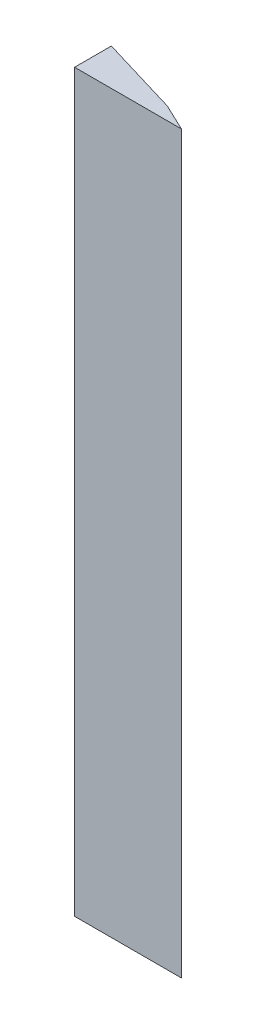
ISO-10303-21;
HEADER;
FILE_DESCRIPTION(('STEP AP214'),'2;1');
FILE_NAME('part.step','',(''),(''),'','','');
FILE_SCHEMA(('AUTOMOTIVE_DESIGN { 1 0 10303 214 1 1 1 1 }'));
ENDSEC;
DATA;
#1=APPLICATION_CONTEXT('core data for automotive mechanical design processes');
#2=APPLICATION_PROTOCOL_DEFINITION('international standard','automotive_design',2000,#1);
#3=PRODUCT_CONTEXT('',#1,'mechanical');
#4=PRODUCT('Part','Part','',(#3));
#5=PRODUCT_RELATED_PRODUCT_CATEGORY('part','',(#4));
#6=PRODUCT_DEFINITION_FORMATION('','',#4);
#7=PRODUCT_DEFINITION_CONTEXT('part definition',#1,'design');
#8=PRODUCT_DEFINITION('design','',#6,#7);
#9=PRODUCT_DEFINITION_SHAPE('','',#8);
#10=(LENGTH_UNIT() NAMED_UNIT(*) SI_UNIT(.MILLI.,.METRE.));
#11=(NAMED_UNIT(*) PLANE_ANGLE_UNIT() SI_UNIT($,.RADIAN.));
#12=(NAMED_UNIT(*) SI_UNIT($,.STERADIAN.) SOLID_ANGLE_UNIT());
#13=UNCERTAINTY_MEASURE_WITH_UNIT(LENGTH_MEASURE(1.E-05),#10,'distance_accuracy_value','');
#14=(GEOMETRIC_REPRESENTATION_CONTEXT(3) GLOBAL_UNCERTAINTY_ASSIGNED_CONTEXT((#13)) GLOBAL_UNIT_ASSIGNED_CONTEXT((#10,
#11,#12)) REPRESENTATION_CONTEXT('',''));
#15=CARTESIAN_POINT('',(0.,0.,0.));
#16=DIRECTION('',(0.,0.,1.));
#17=DIRECTION('',(1.,0.,0.));
#18=AXIS2_PLACEMENT_3D('',#15,#16,#17);
#19=CARTESIAN_POINT('',(25.,150.,0.));
#20=DIRECTION('',(0.,0.,-1.));
#21=DIRECTION('',(-1.,0.,0.));
#22=AXIS2_PLACEMENT_3D('',#19,#20,#21);
#23=PLANE('',#22);
#24=DIRECTION('',(1.,0.,0.));
#25=VECTOR('',#24,1.);
#26=CARTESIAN_POINT('',(25.,0.,0.));
#27=LINE('',#26,#25);
#28=CARTESIAN_POINT('',(0.,0.,0.));
#29=VERTEX_POINT('',#28);
#30=CARTESIAN_POINT('',(21.7891738452536,0.,0.));
#31=VERTEX_POINT('',#30);
#32=EDGE_CURVE('E95',#29,#31,#27,.T.);
#33=ORIENTED_EDGE('',*,*,#32,.T.);
#34=DIRECTION('',(0.,1.,0.));
#35=VECTOR('',#34,1.);
#36=CARTESIAN_POINT('',(21.7891738452537,0.,0.));
#37=LINE('',#36,#35);
#38=CARTESIAN_POINT('',(21.7891738452537,150.,0.));
#39=VERTEX_POINT('',#38);
#40=EDGE_CURVE('E60',#31,#39,#37,.T.);
#41=ORIENTED_EDGE('',*,*,#40,.T.);
#42=DIRECTION('',(1.,0.,0.));
#43=VECTOR('',#42,1.);
#44=CARTESIAN_POINT('',(25.,150.,0.));
#45=LINE('',#44,#43);
#46=CARTESIAN_POINT('',(0.,150.,0.));
#47=VERTEX_POINT('',#46);
#48=EDGE_CURVE('E90',#47,#39,#45,.T.);
#49=ORIENTED_EDGE('',*,*,#48,.F.);
#50=DIRECTION('',(0.,-1.,0.));
#51=VECTOR('',#50,1.);
#52=CARTESIAN_POINT('',(0.,150.,0.));
#53=LINE('',#52,#51);
#54=EDGE_CURVE('E53',#47,#29,#53,.T.);
#55=ORIENTED_EDGE('',*,*,#54,.T.);
#56=EDGE_LOOP('',(#33,#41,#49,#55));
#57=FACE_BOUND('',#56,.T.);
#58=ADVANCED_FACE('F45',(#57),#23,.F.);
#59=CARTESIAN_POINT('',(0.,150.,-7.5));
#60=DIRECTION('',(-0.287347885566345,0.,0.957826285221151));
#61=DIRECTION('',(0.957826285221151,0.,0.287347885566345));
#62=AXIS2_PLACEMENT_3D('',#59,#60,#61);
#63=PLANE('',#62);
#64=DIRECTION('',(-0.957826285221151,0.,-0.287347885566345));
#65=VECTOR('',#64,1.);
#66=CARTESIAN_POINT('',(0.,150.,-7.5));
#67=LINE('',#66,#65);
#68=CARTESIAN_POINT('',(16.3101493977045,150.,-2.60695518068865));
#69=VERTEX_POINT('',#68);
#70=CARTESIAN_POINT('',(0.,150.,-7.5));
#71=VERTEX_POINT('',#70);
#72=EDGE_CURVE('E109',#69,#71,#67,.T.);
#73=ORIENTED_EDGE('',*,*,#72,.F.);
#74=DIRECTION('',(0.,1.,0.));
#75=VECTOR('',#74,1.);
#76=CARTESIAN_POINT('',(16.3101493977045,0.,-2.60695518068865));
#77=LINE('',#76,#75);
#78=CARTESIAN_POINT('',(16.3101493977045,0.,-2.60695518068865));
#79=VERTEX_POINT('',#78);
#80=EDGE_CURVE('E104',#79,#69,#77,.T.);
#81=ORIENTED_EDGE('',*,*,#80,.F.);
#82=DIRECTION('',(-0.957826285221151,0.,-0.287347885566345));
#83=VECTOR('',#82,1.);
#84=CARTESIAN_POINT('',(0.,0.,-7.5));
#85=LINE('',#84,#83);
#86=CARTESIAN_POINT('',(0.,0.,-7.5));
#87=VERTEX_POINT('',#86);
#88=EDGE_CURVE('E91',#79,#87,#85,.T.);
#89=ORIENTED_EDGE('',*,*,#88,.T.);
#90=DIRECTION('',(0.,-1.,0.));
#91=VECTOR('',#90,1.);
#92=CARTESIAN_POINT('',(0.,150.,-7.5));
#93=LINE('',#92,#91);
#94=EDGE_CURVE('E11',#71,#87,#93,.T.);
#95=ORIENTED_EDGE('',*,*,#94,.F.);
#96=EDGE_LOOP('',(#73,#81,#89,#95));
#97=FACE_BOUND('',#96,.T.);
#98=ADVANCED_FACE('F136',(#97),#63,.F.);
#99=CARTESIAN_POINT('',(0.,150.,0.));
#100=DIRECTION('',(1.,0.,0.));
#101=DIRECTION('',(0.,0.,-1.));
#102=AXIS2_PLACEMENT_3D('',#99,#100,#101);
#103=PLANE('',#102);
#104=DIRECTION('',(0.,0.,1.));
#105=VECTOR('',#104,1.);
#106=CARTESIAN_POINT('',(0.,0.,0.));
#107=LINE('',#106,#105);
#108=EDGE_CURVE('E81',#87,#29,#107,.T.);
#109=ORIENTED_EDGE('',*,*,#108,.T.);
#110=ORIENTED_EDGE('',*,*,#54,.F.);
#111=DIRECTION('',(0.,0.,1.));
#112=VECTOR('',#111,1.);
#113=CARTESIAN_POINT('',(0.,150.,0.));
#114=LINE('',#113,#112);
#115=EDGE_CURVE('E69',#71,#47,#114,.T.);
#116=ORIENTED_EDGE('',*,*,#115,.F.);
#117=ORIENTED_EDGE('',*,*,#94,.T.);
#118=EDGE_LOOP('',(#109,#110,#116,#117));
#119=FACE_BOUND('',#118,.T.);
#120=ADVANCED_FACE('F83',(#119),#103,.F.);
#121=CARTESIAN_POINT('',(0.,150.,0.));
#122=DIRECTION('',(0.,-1.,0.));
#123=DIRECTION('',(0.,0.,-1.));
#124=AXIS2_PLACEMENT_3D('',#121,#122,#123);
#125=PLANE('',#124);
#126=ORIENTED_EDGE('',*,*,#48,.T.);
#127=DIRECTION('',(0.902995081197875,0.,0.429650885408657));
#128=VECTOR('',#127,1.);
#129=CARTESIAN_POINT('',(16.3101493977045,150.,-2.60695518068865));
#130=LINE('',#129,#128);
#131=EDGE_CURVE('E117',#69,#39,#130,.T.);
#132=ORIENTED_EDGE('',*,*,#131,.F.);
#133=ORIENTED_EDGE('',*,*,#72,.T.);
#134=ORIENTED_EDGE('',*,*,#115,.T.);
#135=EDGE_LOOP('',(#126,#132,#133,#134));
#136=FACE_BOUND('',#135,.T.);
#137=ADVANCED_FACE('F127',(#136),#125,.F.);
#138=CARTESIAN_POINT('',(0.,0.,0.));
#139=DIRECTION('',(0.,-1.,0.));
#140=DIRECTION('',(0.,0.,-1.));
#141=AXIS2_PLACEMENT_3D('',#138,#139,#140);
#142=PLANE('',#141);
#143=DIRECTION('',(0.902995081197875,0.,0.429650885408657));
#144=VECTOR('',#143,1.);
#145=CARTESIAN_POINT('',(16.3101493977045,0.,-2.60695518068865));
#146=LINE('',#145,#144);
#147=EDGE_CURVE('E98',#79,#31,#146,.T.);
#148=ORIENTED_EDGE('',*,*,#147,.T.);
#149=ORIENTED_EDGE('',*,*,#32,.F.);
#150=ORIENTED_EDGE('',*,*,#108,.F.);
#151=ORIENTED_EDGE('',*,*,#88,.F.);
#152=EDGE_LOOP('',(#148,#149,#150,#151));
#153=FACE_BOUND('',#152,.T.);
#154=ADVANCED_FACE('F97',(#153),#142,.T.);
#155=CARTESIAN_POINT('',(16.3101493977045,0.,-2.60695518068865));
#156=DIRECTION('',(-0.429650885408657,0.,0.902995081197875));
#157=DIRECTION('',(0.902995081197875,0.,0.429650885408657));
#158=AXIS2_PLACEMENT_3D('',#155,#156,#157);
#159=PLANE('',#158);
#160=ORIENTED_EDGE('',*,*,#131,.T.);
#161=ORIENTED_EDGE('',*,*,#40,.F.);
#162=ORIENTED_EDGE('',*,*,#147,.F.);
#163=ORIENTED_EDGE('',*,*,#80,.T.);
#164=EDGE_LOOP('',(#160,#161,#162,#163));
#165=FACE_BOUND('',#164,.T.);
#166=ADVANCED_FACE('F123',(#165),#159,.F.);
#167=CLOSED_SHELL('',(#58,#98,#120,#137,#154,#166));
#168=MANIFOLD_SOLID_BREP('B2',#167);
#169=ADVANCED_BREP_SHAPE_REPRESENTATION('',(#18,#168),#14);
#170=SHAPE_DEFINITION_REPRESENTATION(#9,#169);
ENDSEC;
END-ISO-10303-21;
